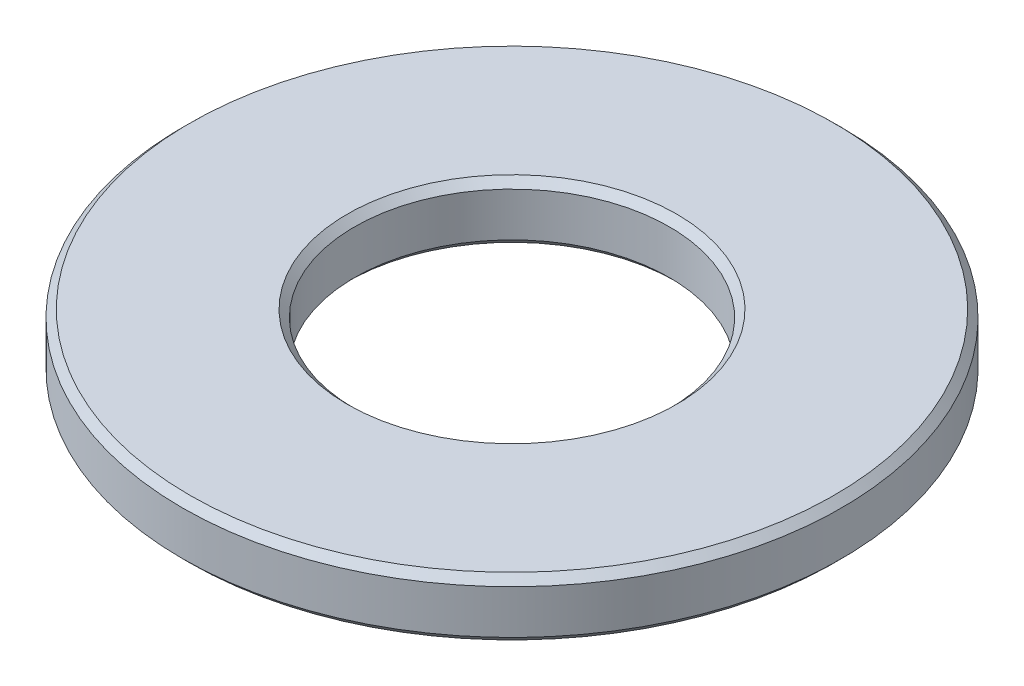
ISO-10303-21;
HEADER;
FILE_DESCRIPTION(('STEP AP214'),'2;1');
FILE_NAME('part.step','',(''),(''),'','','');
FILE_SCHEMA(('AUTOMOTIVE_DESIGN { 1 0 10303 214 1 1 1 1 }'));
ENDSEC;
DATA;
#1=APPLICATION_CONTEXT('core data for automotive mechanical design processes');
#2=APPLICATION_PROTOCOL_DEFINITION('international standard','automotive_design',2000,#1);
#3=PRODUCT_CONTEXT('',#1,'mechanical');
#4=PRODUCT('Part','Part','',(#3));
#5=PRODUCT_RELATED_PRODUCT_CATEGORY('part','',(#4));
#6=PRODUCT_DEFINITION_FORMATION('','',#4);
#7=PRODUCT_DEFINITION_CONTEXT('part definition',#1,'design');
#8=PRODUCT_DEFINITION('design','',#6,#7);
#9=PRODUCT_DEFINITION_SHAPE('','',#8);
#10=(LENGTH_UNIT() NAMED_UNIT(*) SI_UNIT(.MILLI.,.METRE.));
#11=(NAMED_UNIT(*) PLANE_ANGLE_UNIT() SI_UNIT($,.RADIAN.));
#12=(NAMED_UNIT(*) SI_UNIT($,.STERADIAN.) SOLID_ANGLE_UNIT());
#13=UNCERTAINTY_MEASURE_WITH_UNIT(LENGTH_MEASURE(1.E-05),#10,'distance_accuracy_value','');
#14=(GEOMETRIC_REPRESENTATION_CONTEXT(3) GLOBAL_UNCERTAINTY_ASSIGNED_CONTEXT((#13)) GLOBAL_UNIT_ASSIGNED_CONTEXT((#10,
#11,#12)) REPRESENTATION_CONTEXT('',''));
#15=CARTESIAN_POINT('',(0.,0.,0.));
#16=DIRECTION('',(0.,0.,1.));
#17=DIRECTION('',(1.,0.,0.));
#18=AXIS2_PLACEMENT_3D('',#15,#16,#17);
#19=CARTESIAN_POINT('',(0.,0.8,0.));
#20=DIRECTION('',(0.,1.,0.));
#21=DIRECTION('',(0.,0.,1.));
#22=AXIS2_PLACEMENT_3D('',#19,#20,#21);
#23=PLANE('',#22);
#24=CARTESIAN_POINT('',(0.,0.8,0.));
#25=DIRECTION('',(0.,1.,0.));
#26=DIRECTION('',(0.,0.,1.));
#27=AXIS2_PLACEMENT_3D('',#24,#25,#26);
#28=CIRCLE('',#27,4.4);
#29=CARTESIAN_POINT('',(0.,0.8,4.4));
#30=VERTEX_POINT('',#29);
#31=EDGE_CURVE('E10',#30,#30,#28,.T.);
#32=ORIENTED_EDGE('',*,*,#31,.T.);
#33=EDGE_LOOP('',(#32));
#34=FACE_BOUND('',#33,.T.);
#35=CARTESIAN_POINT('',(0.,0.8,0.));
#36=DIRECTION('',(0.,1.,0.));
#37=DIRECTION('',(0.,0.,1.));
#38=AXIS2_PLACEMENT_3D('',#35,#36,#37);
#39=CIRCLE('',#38,2.25);
#40=CARTESIAN_POINT('',(0.,0.8,2.25));
#41=VERTEX_POINT('',#40);
#42=EDGE_CURVE('E42',#41,#41,#39,.F.);
#43=ORIENTED_EDGE('',*,*,#42,.T.);
#44=EDGE_LOOP('',(#43));
#45=FACE_BOUND('',#44,.T.);
#46=ADVANCED_FACE('F34',(#34,#45),#23,.T.);
#47=CARTESIAN_POINT('',(0.,0.,0.));
#48=DIRECTION('',(0.,1.,0.));
#49=DIRECTION('',(0.,0.,1.));
#50=AXIS2_PLACEMENT_3D('',#47,#48,#49);
#51=PLANE('',#50);
#52=CARTESIAN_POINT('',(0.,0.,0.));
#53=DIRECTION('',(0.,1.,0.));
#54=DIRECTION('',(0.,0.,1.));
#55=AXIS2_PLACEMENT_3D('',#52,#53,#54);
#56=CIRCLE('',#55,2.25);
#57=CARTESIAN_POINT('',(0.,0.,2.25));
#58=VERTEX_POINT('',#57);
#59=EDGE_CURVE('E61',#58,#58,#56,.T.);
#60=ORIENTED_EDGE('',*,*,#59,.T.);
#61=EDGE_LOOP('',(#60));
#62=FACE_BOUND('',#61,.T.);
#63=CARTESIAN_POINT('',(0.,0.,0.));
#64=DIRECTION('',(0.,1.,0.));
#65=DIRECTION('',(0.,0.,1.));
#66=AXIS2_PLACEMENT_3D('',#63,#64,#65);
#67=CIRCLE('',#66,4.4);
#68=CARTESIAN_POINT('',(0.,0.,4.4));
#69=VERTEX_POINT('',#68);
#70=EDGE_CURVE('E64',#69,#69,#67,.F.);
#71=ORIENTED_EDGE('',*,*,#70,.T.);
#72=EDGE_LOOP('',(#71));
#73=FACE_BOUND('',#72,.T.);
#74=ADVANCED_FACE('F68',(#62,#73),#51,.F.);
#75=CARTESIAN_POINT('',(0.,0.8,0.));
#76=DIRECTION('',(0.,-1.,0.));
#77=DIRECTION('',(0.,0.,-1.));
#78=AXIS2_PLACEMENT_3D('',#75,#76,#77);
#79=CYLINDRICAL_SURFACE('',#78,4.5);
#80=CARTESIAN_POINT('',(0.,0.1,0.));
#81=DIRECTION('',(0.,1.,0.));
#82=DIRECTION('',(0.,0.,1.));
#83=AXIS2_PLACEMENT_3D('',#80,#81,#82);
#84=CIRCLE('',#83,4.5);
#85=CARTESIAN_POINT('',(0.,0.1,4.5));
#86=VERTEX_POINT('',#85);
#87=EDGE_CURVE('E46',#86,#86,#84,.T.);
#88=ORIENTED_EDGE('',*,*,#87,.T.);
#89=EDGE_LOOP('',(#88));
#90=FACE_BOUND('',#89,.T.);
#91=CARTESIAN_POINT('',(0.,0.699999999999998,0.));
#92=DIRECTION('',(0.,1.,0.));
#93=DIRECTION('',(0.,0.,1.));
#94=AXIS2_PLACEMENT_3D('',#91,#92,#93);
#95=CIRCLE('',#94,4.5);
#96=CARTESIAN_POINT('',(0.,0.699999999999998,4.5));
#97=VERTEX_POINT('',#96);
#98=EDGE_CURVE('E50',#97,#97,#95,.F.);
#99=ORIENTED_EDGE('',*,*,#98,.T.);
#100=EDGE_LOOP('',(#99));
#101=FACE_BOUND('',#100,.T.);
#102=ADVANCED_FACE('F78',(#90,#101),#79,.T.);
#103=CARTESIAN_POINT('',(0.,0.8,0.));
#104=DIRECTION('',(0.,-1.,0.));
#105=DIRECTION('',(0.,0.,-1.));
#106=AXIS2_PLACEMENT_3D('',#103,#104,#105);
#107=CYLINDRICAL_SURFACE('',#106,2.15);
#108=CARTESIAN_POINT('',(0.,0.100000000000001,0.));
#109=DIRECTION('',(0.,1.,0.));
#110=DIRECTION('',(0.,0.,1.));
#111=AXIS2_PLACEMENT_3D('',#108,#109,#110);
#112=CIRCLE('',#111,2.15);
#113=CARTESIAN_POINT('',(0.,0.100000000000001,2.15));
#114=VERTEX_POINT('',#113);
#115=EDGE_CURVE('E55',#114,#114,#112,.F.);
#116=ORIENTED_EDGE('',*,*,#115,.T.);
#117=EDGE_LOOP('',(#116));
#118=FACE_BOUND('',#117,.T.);
#119=CARTESIAN_POINT('',(0.,0.7,0.));
#120=DIRECTION('',(0.,1.,0.));
#121=DIRECTION('',(0.,0.,1.));
#122=AXIS2_PLACEMENT_3D('',#119,#120,#121);
#123=CIRCLE('',#122,2.15);
#124=CARTESIAN_POINT('',(0.,0.7,2.15));
#125=VERTEX_POINT('',#124);
#126=EDGE_CURVE('E58',#125,#125,#123,.T.);
#127=ORIENTED_EDGE('',*,*,#126,.T.);
#128=EDGE_LOOP('',(#127));
#129=FACE_BOUND('',#128,.T.);
#130=ADVANCED_FACE('F81',(#118,#129),#107,.F.);
#131=CARTESIAN_POINT('',(0.,0.,0.));
#132=DIRECTION('',(0.,-1.,0.));
#133=DIRECTION('',(0.,0.,-1.));
#134=AXIS2_PLACEMENT_3D('',#131,#132,#133);
#135=CONICAL_SURFACE('',#134,2.25,0.785398163397446);
#136=ORIENTED_EDGE('',*,*,#115,.F.);
#137=EDGE_LOOP('',(#136));
#138=FACE_BOUND('',#137,.T.);
#139=ORIENTED_EDGE('',*,*,#59,.F.);
#140=EDGE_LOOP('',(#139));
#141=FACE_BOUND('',#140,.T.);
#142=ADVANCED_FACE('F74',(#138,#141),#135,.F.);
#143=CARTESIAN_POINT('',(0.,0.1,0.));
#144=DIRECTION('',(0.,1.,0.));
#145=DIRECTION('',(0.,0.,1.));
#146=AXIS2_PLACEMENT_3D('',#143,#144,#145);
#147=CONICAL_SURFACE('',#146,4.5,0.785398163397448);
#148=ORIENTED_EDGE('',*,*,#70,.F.);
#149=EDGE_LOOP('',(#148));
#150=FACE_BOUND('',#149,.T.);
#151=ORIENTED_EDGE('',*,*,#87,.F.);
#152=EDGE_LOOP('',(#151));
#153=FACE_BOUND('',#152,.T.);
#154=ADVANCED_FACE('F70',(#150,#153),#147,.T.);
#155=CARTESIAN_POINT('',(0.,0.8,0.));
#156=DIRECTION('',(0.,-1.,0.));
#157=DIRECTION('',(0.,0.,-1.));
#158=AXIS2_PLACEMENT_3D('',#155,#156,#157);
#159=CONICAL_SURFACE('',#158,4.4,0.785398163397448);
#160=ORIENTED_EDGE('',*,*,#98,.F.);
#161=EDGE_LOOP('',(#160));
#162=FACE_BOUND('',#161,.T.);
#163=ORIENTED_EDGE('',*,*,#31,.F.);
#164=EDGE_LOOP('',(#163));
#165=FACE_BOUND('',#164,.T.);
#166=ADVANCED_FACE('F73',(#162,#165),#159,.T.);
#167=CARTESIAN_POINT('',(0.,0.7,0.));
#168=DIRECTION('',(0.,1.,0.));
#169=DIRECTION('',(0.,0.,1.));
#170=AXIS2_PLACEMENT_3D('',#167,#168,#169);
#171=CONICAL_SURFACE('',#170,2.15,0.785398163397448);
#172=ORIENTED_EDGE('',*,*,#42,.F.);
#173=EDGE_LOOP('',(#172));
#174=FACE_BOUND('',#173,.T.);
#175=ORIENTED_EDGE('',*,*,#126,.F.);
#176=EDGE_LOOP('',(#175));
#177=FACE_BOUND('',#176,.T.);
#178=ADVANCED_FACE('F37',(#174,#177),#171,.F.);
#179=CLOSED_SHELL('',(#46,#74,#102,#130,#142,#154,#166,#178));
#180=MANIFOLD_SOLID_BREP('B2',#179);
#181=ADVANCED_BREP_SHAPE_REPRESENTATION('',(#18,#180),#14);
#182=SHAPE_DEFINITION_REPRESENTATION(#9,#181);
ENDSEC;
END-ISO-10303-21;
